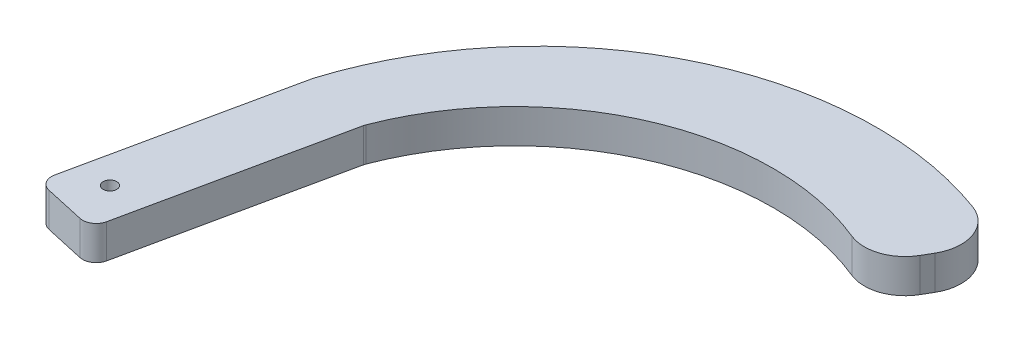
ISO-10303-21;
HEADER;
FILE_DESCRIPTION(('STEP AP214'),'2;1');
FILE_NAME('part.step','',(''),(''),'','','');
FILE_SCHEMA(('AUTOMOTIVE_DESIGN { 1 0 10303 214 1 1 1 1 }'));
ENDSEC;
DATA;
#1=APPLICATION_CONTEXT('core data for automotive mechanical design processes');
#2=APPLICATION_PROTOCOL_DEFINITION('international standard','automotive_design',2000,#1);
#3=PRODUCT_CONTEXT('',#1,'mechanical');
#4=PRODUCT('Part','Part','',(#3));
#5=PRODUCT_RELATED_PRODUCT_CATEGORY('part','',(#4));
#6=PRODUCT_DEFINITION_FORMATION('','',#4);
#7=PRODUCT_DEFINITION_CONTEXT('part definition',#1,'design');
#8=PRODUCT_DEFINITION('design','',#6,#7);
#9=PRODUCT_DEFINITION_SHAPE('','',#8);
#10=(LENGTH_UNIT() NAMED_UNIT(*) SI_UNIT(.MILLI.,.METRE.));
#11=(NAMED_UNIT(*) PLANE_ANGLE_UNIT() SI_UNIT($,.RADIAN.));
#12=(NAMED_UNIT(*) SI_UNIT($,.STERADIAN.) SOLID_ANGLE_UNIT());
#13=UNCERTAINTY_MEASURE_WITH_UNIT(LENGTH_MEASURE(1.E-05),#10,'distance_accuracy_value','');
#14=(GEOMETRIC_REPRESENTATION_CONTEXT(3) GLOBAL_UNCERTAINTY_ASSIGNED_CONTEXT((#13)) GLOBAL_UNIT_ASSIGNED_CONTEXT((#10,
#11,#12)) REPRESENTATION_CONTEXT('',''));
#15=CARTESIAN_POINT('',(0.,0.,0.));
#16=DIRECTION('',(0.,0.,1.));
#17=DIRECTION('',(1.,0.,0.));
#18=AXIS2_PLACEMENT_3D('',#15,#16,#17);
#19=CARTESIAN_POINT('',(60.5578918129305,6.35,18.64433074397));
#20=DIRECTION('',(0.,-1.,0.));
#21=DIRECTION('',(0.,0.,-1.));
#22=AXIS2_PLACEMENT_3D('',#19,#20,#21);
#23=PLANE('',#22);
#24=CARTESIAN_POINT('',(60.5578918129305,6.35,18.64433074397));
#25=DIRECTION('',(0.,1.,0.));
#26=DIRECTION('',(0.,0.,-1.));
#27=AXIS2_PLACEMENT_3D('',#24,#25,#26);
#28=CIRCLE('',#27,63.3629965336011);
#29=CARTESIAN_POINT('',(82.4371898984211,6.35,-40.8213370400832));
#30=VERTEX_POINT('',#29);
#31=CARTESIAN_POINT('',(0.0340792868652462,6.35,-0.110333929834405));
#32=VERTEX_POINT('',#31);
#33=EDGE_CURVE('E150',#30,#32,#28,.T.);
#34=ORIENTED_EDGE('',*,*,#33,.T.);
#35=CARTESIAN_POINT('',(2.4602663712258,6.35,0.641474710500365));
#36=DIRECTION('',(0.,-1.,0.));
#37=DIRECTION('',(0.,0.,-1.));
#38=AXIS2_PLACEMENT_3D('',#35,#36,#37);
#39=CIRCLE('',#38,2.54);
#40=CARTESIAN_POINT('',(-0.0236448872723517,6.35,0.110640593373262));
#41=VERTEX_POINT('',#40);
#42=EDGE_CURVE('E227',#32,#41,#39,.F.);
#43=ORIENTED_EDGE('',*,*,#42,.T.);
#44=DIRECTION('',(-0.20898980989256,0.,0.97791781830636));
#45=VECTOR('',#44,1.);
#46=CARTESIAN_POINT('',(0.,6.35,0.));
#47=LINE('',#46,#45);
#48=CARTESIAN_POINT('',(-8.49810560298567,6.35,39.7648521489212));
#49=VERTEX_POINT('',#48);
#50=EDGE_CURVE('E269',#41,#49,#47,.T.);
#51=ORIENTED_EDGE('',*,*,#50,.T.);
#52=CARTESIAN_POINT('',(-6.01419434448752,6.35,40.2956862660483));
#53=DIRECTION('',(0.,-1.,0.));
#54=DIRECTION('',(0.,0.,-1.));
#55=AXIS2_PLACEMENT_3D('',#52,#53,#54);
#56=CIRCLE('',#55,2.54);
#57=CARTESIAN_POINT('',(-6.56587830956438,6.35,42.7750500559502));
#58=VERTEX_POINT('',#57);
#59=EDGE_CURVE('E224',#49,#58,#56,.F.);
#60=ORIENTED_EDGE('',*,*,#59,.T.);
#61=DIRECTION('',(0.976127476339359,0.,0.217198411447583));
#62=VECTOR('',#61,1.);
#63=CARTESIAN_POINT('',(-9.02449849487913,6.35,42.2279817564224));
#64=LINE('',#63,#62);
#65=CARTESIAN_POINT('',(0.872475583690637,6.35,44.4301603653728));
#66=VERTEX_POINT('',#65);
#67=EDGE_CURVE('E263',#58,#66,#64,.T.);
#68=ORIENTED_EDGE('',*,*,#67,.T.);
#69=CARTESIAN_POINT('',(1.4241595487675,6.35,41.9507965754709));
#70=DIRECTION('',(0.,-1.,0.));
#71=DIRECTION('',(0.,0.,-1.));
#72=AXIS2_PLACEMENT_3D('',#69,#70,#71);
#73=CIRCLE('',#72,2.54);
#74=CARTESIAN_POINT('',(3.90807080726565,6.35,42.481630692598));
#75=VERTEX_POINT('',#74);
#76=EDGE_CURVE('E221',#66,#75,#73,.F.);
#77=ORIENTED_EDGE('',*,*,#76,.T.);
#78=DIRECTION('',(0.20898980989256,0.,-0.97791781830636));
#79=VECTOR('',#78,1.);
#80=CARTESIAN_POINT('',(12.3972564887583,6.35,2.75851718237099));
#81=LINE('',#80,#79);
#82=CARTESIAN_POINT('',(12.3563941309286,6.35,2.94972281024476));
#83=VERTEX_POINT('',#82);
#84=EDGE_CURVE('E259',#75,#83,#81,.T.);
#85=ORIENTED_EDGE('',*,*,#84,.T.);
#86=CARTESIAN_POINT('',(14.8403053894267,6.35,3.48055692737186));
#87=DIRECTION('',(0.,-1.,0.));
#88=DIRECTION('',(0.,0.,-1.));
#89=AXIS2_PLACEMENT_3D('',#86,#87,#88);
#90=CIRCLE('',#89,2.54);
#91=CARTESIAN_POINT('',(12.4688141612082,6.35,2.57081556056331));
#92=VERTEX_POINT('',#91);
#93=EDGE_CURVE('E11',#83,#92,#90,.T.);
#94=ORIENTED_EDGE('',*,*,#93,.T.);
#95=CARTESIAN_POINT('',(57.5427590882242,6.35,19.8618903819368));
#96=DIRECTION('',(0.,-1.,0.));
#97=DIRECTION('',(0.,0.,-1.));
#98=AXIS2_PLACEMENT_3D('',#95,#96,#97);
#99=CIRCLE('',#98,48.2767208886644);
#100=CARTESIAN_POINT('',(75.8608882722929,6.35,-24.804516715095));
#101=VERTEX_POINT('',#100);
#102=EDGE_CURVE('E255',#92,#101,#99,.T.);
#103=ORIENTED_EDGE('',*,*,#102,.T.);
#104=CARTESIAN_POINT('',(78.7522226838515,6.35,-31.8546646086174));
#105=DIRECTION('',(0.,-1.,0.));
#106=DIRECTION('',(0.,0.,-1.));
#107=AXIS2_PLACEMENT_3D('',#104,#105,#106);
#108=CIRCLE('',#107,7.62);
#109=CARTESIAN_POINT('',(85.3423987423466,6.35,-28.0292261346594));
#110=VERTEX_POINT('',#109);
#111=EDGE_CURVE('E193',#101,#110,#108,.F.);
#112=ORIENTED_EDGE('',*,*,#111,.T.);
#113=DIRECTION('',(0.502026046451173,0.,-0.864852501114846));
#114=VECTOR('',#113,1.);
#115=CARTESIAN_POINT('',(81.7789304115871,6.35,-21.890352424248));
#116=LINE('',#115,#114);
#117=CARTESIAN_POINT('',(86.3961732966539,6.35,-29.844589232543));
#118=VERTEX_POINT('',#117);
#119=EDGE_CURVE('E152',#110,#118,#116,.T.);
#120=ORIENTED_EDGE('',*,*,#119,.T.);
#121=CARTESIAN_POINT('',(79.8059972381588,6.35,-33.6700277065009));
#122=DIRECTION('',(0.,-1.,0.));
#123=DIRECTION('',(0.,0.,-1.));
#124=AXIS2_PLACEMENT_3D('',#121,#122,#123);
#125=CIRCLE('',#124,7.62);
#126=EDGE_CURVE('E196',#118,#30,#125,.F.);
#127=ORIENTED_EDGE('',*,*,#126,.T.);
#128=EDGE_LOOP('',(#34,#43,#51,#60,#68,#77,#85,#94,#103,#112,#120,#127));
#129=FACE_BOUND('',#128,.T.);
#130=CARTESIAN_POINT('',(-1.63503526528075,6.35,36.3151936826149));
#131=DIRECTION('',(0.,1.,0.));
#132=DIRECTION('',(0.,0.,1.));
#133=AXIS2_PLACEMENT_3D('',#130,#131,#132);
#134=CIRCLE('',#133,1.27);
#135=CARTESIAN_POINT('',(-1.63503526528075,6.35,37.5851936826149));
#136=VERTEX_POINT('',#135);
#137=EDGE_CURVE('E160',#136,#136,#134,.T.);
#138=ORIENTED_EDGE('',*,*,#137,.F.);
#139=EDGE_LOOP('',(#138));
#140=FACE_BOUND('',#139,.T.);
#141=ADVANCED_FACE('F39',(#129,#140),#23,.F.);
#142=CARTESIAN_POINT('',(60.5578918129305,0.,18.64433074397));
#143=DIRECTION('',(0.,-1.,0.));
#144=DIRECTION('',(0.,0.,-1.));
#145=AXIS2_PLACEMENT_3D('',#142,#143,#144);
#146=PLANE('',#145);
#147=DIRECTION('',(-0.20898980989256,0.,0.97791781830636));
#148=VECTOR('',#147,1.);
#149=CARTESIAN_POINT('',(0.,0.,0.));
#150=LINE('',#149,#148);
#151=CARTESIAN_POINT('',(-0.0236448872723517,0.,0.110640593373262));
#152=VERTEX_POINT('',#151);
#153=CARTESIAN_POINT('',(-8.49810560298567,0.,39.7648521489212));
#154=VERTEX_POINT('',#153);
#155=EDGE_CURVE('E159',#152,#154,#150,.T.);
#156=ORIENTED_EDGE('',*,*,#155,.F.);
#157=CARTESIAN_POINT('',(2.4602663712258,0.,0.641474710500365));
#158=DIRECTION('',(0.,-1.,0.));
#159=DIRECTION('',(0.,0.,-1.));
#160=AXIS2_PLACEMENT_3D('',#157,#158,#159);
#161=CIRCLE('',#160,2.54);
#162=CARTESIAN_POINT('',(0.0340792868652462,0.,-0.110333929834405));
#163=VERTEX_POINT('',#162);
#164=EDGE_CURVE('E157',#152,#163,#161,.T.);
#165=ORIENTED_EDGE('',*,*,#164,.T.);
#166=CARTESIAN_POINT('',(60.5578918129305,0.,18.64433074397));
#167=DIRECTION('',(0.,1.,0.));
#168=DIRECTION('',(0.,0.,-1.));
#169=AXIS2_PLACEMENT_3D('',#166,#167,#168);
#170=CIRCLE('',#169,63.3629965336011);
#171=CARTESIAN_POINT('',(82.4371898984211,0.,-40.8213370400832));
#172=VERTEX_POINT('',#171);
#173=EDGE_CURVE('E147',#172,#163,#170,.T.);
#174=ORIENTED_EDGE('',*,*,#173,.F.);
#175=CARTESIAN_POINT('',(79.8059972381588,0.,-33.6700277065009));
#176=DIRECTION('',(0.,-1.,0.));
#177=DIRECTION('',(0.,0.,-1.));
#178=AXIS2_PLACEMENT_3D('',#175,#176,#177);
#179=CIRCLE('',#178,7.62);
#180=CARTESIAN_POINT('',(86.3961732966539,0.,-29.844589232543));
#181=VERTEX_POINT('',#180);
#182=EDGE_CURVE('E129',#172,#181,#179,.T.);
#183=ORIENTED_EDGE('',*,*,#182,.T.);
#184=DIRECTION('',(0.502026046451173,0.,-0.864852501114846));
#185=VECTOR('',#184,1.);
#186=CARTESIAN_POINT('',(81.7789304115871,0.,-21.890352424248));
#187=LINE('',#186,#185);
#188=CARTESIAN_POINT('',(85.3423987423466,0.,-28.0292261346594));
#189=VERTEX_POINT('',#188);
#190=EDGE_CURVE('E182',#189,#181,#187,.T.);
#191=ORIENTED_EDGE('',*,*,#190,.F.);
#192=CARTESIAN_POINT('',(78.7522226838515,0.,-31.8546646086174));
#193=DIRECTION('',(0.,-1.,0.));
#194=DIRECTION('',(0.,0.,-1.));
#195=AXIS2_PLACEMENT_3D('',#192,#193,#194);
#196=CIRCLE('',#195,7.62);
#197=CARTESIAN_POINT('',(75.8608882722929,0.,-24.804516715095));
#198=VERTEX_POINT('',#197);
#199=EDGE_CURVE('E141',#189,#198,#196,.T.);
#200=ORIENTED_EDGE('',*,*,#199,.T.);
#201=CARTESIAN_POINT('',(57.5427590882242,0.,19.8618903819368));
#202=DIRECTION('',(0.,-1.,0.));
#203=DIRECTION('',(0.,0.,-1.));
#204=AXIS2_PLACEMENT_3D('',#201,#202,#203);
#205=CIRCLE('',#204,48.2767208886644);
#206=CARTESIAN_POINT('',(12.4688141612082,0.,2.57081556056331));
#207=VERTEX_POINT('',#206);
#208=EDGE_CURVE('E179',#207,#198,#205,.T.);
#209=ORIENTED_EDGE('',*,*,#208,.F.);
#210=CARTESIAN_POINT('',(14.8403053894267,0.,3.48055692737186));
#211=DIRECTION('',(0.,-1.,0.));
#212=DIRECTION('',(0.,0.,-1.));
#213=AXIS2_PLACEMENT_3D('',#210,#211,#212);
#214=CIRCLE('',#213,2.54);
#215=CARTESIAN_POINT('',(12.3563941309286,0.,2.94972281024476));
#216=VERTEX_POINT('',#215);
#217=EDGE_CURVE('E48',#207,#216,#214,.F.);
#218=ORIENTED_EDGE('',*,*,#217,.T.);
#219=DIRECTION('',(0.20898980989256,0.,-0.97791781830636));
#220=VECTOR('',#219,1.);
#221=CARTESIAN_POINT('',(12.3972564887583,0.,2.75851718237099));
#222=LINE('',#221,#220);
#223=CARTESIAN_POINT('',(3.90807080726565,0.,42.481630692598));
#224=VERTEX_POINT('',#223);
#225=EDGE_CURVE('E176',#224,#216,#222,.T.);
#226=ORIENTED_EDGE('',*,*,#225,.F.);
#227=CARTESIAN_POINT('',(1.4241595487675,0.,41.9507965754709));
#228=DIRECTION('',(0.,-1.,0.));
#229=DIRECTION('',(0.,0.,-1.));
#230=AXIS2_PLACEMENT_3D('',#227,#228,#229);
#231=CIRCLE('',#230,2.54);
#232=CARTESIAN_POINT('',(0.872475583690637,0.,44.4301603653728));
#233=VERTEX_POINT('',#232);
#234=EDGE_CURVE('E210',#224,#233,#231,.T.);
#235=ORIENTED_EDGE('',*,*,#234,.T.);
#236=DIRECTION('',(0.976127476339359,0.,0.217198411447583));
#237=VECTOR('',#236,1.);
#238=CARTESIAN_POINT('',(-9.02449849487913,0.,42.2279817564224));
#239=LINE('',#238,#237);
#240=CARTESIAN_POINT('',(-6.56587830956438,0.,42.7750500559502));
#241=VERTEX_POINT('',#240);
#242=EDGE_CURVE('E165',#241,#233,#239,.T.);
#243=ORIENTED_EDGE('',*,*,#242,.F.);
#244=CARTESIAN_POINT('',(-6.01419434448752,0.,40.2956862660483));
#245=DIRECTION('',(0.,-1.,0.));
#246=DIRECTION('',(0.,0.,-1.));
#247=AXIS2_PLACEMENT_3D('',#244,#245,#246);
#248=CIRCLE('',#247,2.54);
#249=EDGE_CURVE('E213',#241,#154,#248,.T.);
#250=ORIENTED_EDGE('',*,*,#249,.T.);
#251=EDGE_LOOP('',(#156,#165,#174,#183,#191,#200,#209,#218,#226,#235,#243,#250));
#252=FACE_BOUND('',#251,.T.);
#253=CARTESIAN_POINT('',(-1.63503526528075,0.,36.3151936826149));
#254=DIRECTION('',(0.,1.,0.));
#255=DIRECTION('',(0.,0.,1.));
#256=AXIS2_PLACEMENT_3D('',#253,#254,#255);
#257=CIRCLE('',#256,1.27);
#258=CARTESIAN_POINT('',(-1.63503526528075,0.,37.5851936826149));
#259=VERTEX_POINT('',#258);
#260=EDGE_CURVE('E168',#259,#259,#257,.T.);
#261=ORIENTED_EDGE('',*,*,#260,.T.);
#262=EDGE_LOOP('',(#261));
#263=FACE_BOUND('',#262,.T.);
#264=ADVANCED_FACE('F155',(#252,#263),#146,.T.);
#265=CARTESIAN_POINT('',(60.5578918129305,6.35,18.64433074397));
#266=DIRECTION('',(0.,-1.,0.));
#267=DIRECTION('',(0.,0.,-1.));
#268=AXIS2_PLACEMENT_3D('',#265,#266,#267);
#269=CYLINDRICAL_SURFACE('',#268,63.3629965336011);
#270=ORIENTED_EDGE('',*,*,#173,.T.);
#271=DIRECTION('',(0.,-1.,0.));
#272=VECTOR('',#271,1.);
#273=CARTESIAN_POINT('',(0.0340792868652323,6.35,-0.110333929834408));
#274=LINE('',#273,#272);
#275=EDGE_CURVE('E218',#163,#32,#274,.F.);
#276=ORIENTED_EDGE('',*,*,#275,.T.);
#277=ORIENTED_EDGE('',*,*,#33,.F.);
#278=DIRECTION('',(0.,-1.,0.));
#279=VECTOR('',#278,1.);
#280=CARTESIAN_POINT('',(82.4371898984211,6.35,-40.8213370400833));
#281=LINE('',#280,#279);
#282=EDGE_CURVE('E133',#30,#172,#281,.T.);
#283=ORIENTED_EDGE('',*,*,#282,.T.);
#284=EDGE_LOOP('',(#270,#276,#277,#283));
#285=FACE_BOUND('',#284,.T.);
#286=ADVANCED_FACE('F146',(#285),#269,.T.);
#287=CARTESIAN_POINT('',(0.,6.35,0.));
#288=DIRECTION('',(0.97791781830636,0.,0.20898980989256));
#289=DIRECTION('',(0.20898980989256,0.,-0.97791781830636));
#290=AXIS2_PLACEMENT_3D('',#287,#288,#289);
#291=PLANE('',#290);
#292=ORIENTED_EDGE('',*,*,#50,.F.);
#293=DIRECTION('',(0.,-1.,0.));
#294=VECTOR('',#293,1.);
#295=CARTESIAN_POINT('',(-0.0236448872723517,6.35,0.110640593373262));
#296=LINE('',#295,#294);
#297=EDGE_CURVE('E206',#41,#152,#296,.T.);
#298=ORIENTED_EDGE('',*,*,#297,.T.);
#299=ORIENTED_EDGE('',*,*,#155,.T.);
#300=DIRECTION('',(0.,-1.,0.));
#301=VECTOR('',#300,1.);
#302=CARTESIAN_POINT('',(-8.49810560298567,6.35,39.7648521489212));
#303=LINE('',#302,#301);
#304=EDGE_CURVE('E203',#154,#49,#303,.F.);
#305=ORIENTED_EDGE('',*,*,#304,.T.);
#306=EDGE_LOOP('',(#292,#298,#299,#305));
#307=FACE_BOUND('',#306,.T.);
#308=ADVANCED_FACE('F307',(#307),#291,.F.);
#309=CARTESIAN_POINT('',(-9.02449849487913,6.35,42.2279817564224));
#310=DIRECTION('',(0.217198411447583,0.,-0.976127476339359));
#311=DIRECTION('',(-0.976127476339359,0.,-0.217198411447583));
#312=AXIS2_PLACEMENT_3D('',#309,#310,#311);
#313=PLANE('',#312);
#314=ORIENTED_EDGE('',*,*,#67,.F.);
#315=DIRECTION('',(0.,-1.,0.));
#316=VECTOR('',#315,1.);
#317=CARTESIAN_POINT('',(-6.56587830956438,6.35,42.7750500559502));
#318=LINE('',#317,#316);
#319=EDGE_CURVE('E233',#58,#241,#318,.T.);
#320=ORIENTED_EDGE('',*,*,#319,.T.);
#321=ORIENTED_EDGE('',*,*,#242,.T.);
#322=DIRECTION('',(0.,-1.,0.));
#323=VECTOR('',#322,1.);
#324=CARTESIAN_POINT('',(0.872475583690637,6.35,44.4301603653728));
#325=LINE('',#324,#323);
#326=EDGE_CURVE('E230',#233,#66,#325,.F.);
#327=ORIENTED_EDGE('',*,*,#326,.T.);
#328=EDGE_LOOP('',(#314,#320,#321,#327));
#329=FACE_BOUND('',#328,.T.);
#330=ADVANCED_FACE('F304',(#329),#313,.F.);
#331=CARTESIAN_POINT('',(12.3972564887583,6.35,2.75851718237099));
#332=DIRECTION('',(-0.97791781830636,0.,-0.20898980989256));
#333=DIRECTION('',(-0.20898980989256,0.,0.97791781830636));
#334=AXIS2_PLACEMENT_3D('',#331,#332,#333);
#335=PLANE('',#334);
#336=ORIENTED_EDGE('',*,*,#84,.F.);
#337=DIRECTION('',(0.,-1.,0.));
#338=VECTOR('',#337,1.);
#339=CARTESIAN_POINT('',(3.90807080726565,6.35,42.481630692598));
#340=LINE('',#339,#338);
#341=EDGE_CURVE('E239',#75,#224,#340,.T.);
#342=ORIENTED_EDGE('',*,*,#341,.T.);
#343=ORIENTED_EDGE('',*,*,#225,.T.);
#344=DIRECTION('',(0.,1.,0.));
#345=VECTOR('',#344,1.);
#346=CARTESIAN_POINT('',(12.3563941309286,6.35,2.94972281024476));
#347=LINE('',#346,#345);
#348=EDGE_CURVE('E61',#216,#83,#347,.T.);
#349=ORIENTED_EDGE('',*,*,#348,.T.);
#350=EDGE_LOOP('',(#336,#342,#343,#349));
#351=FACE_BOUND('',#350,.T.);
#352=ADVANCED_FACE('F251',(#351),#335,.F.);
#353=CARTESIAN_POINT('',(57.5427590882242,6.35,19.8618903819368));
#354=DIRECTION('',(0.,-1.,0.));
#355=DIRECTION('',(0.,0.,-1.));
#356=AXIS2_PLACEMENT_3D('',#353,#354,#355);
#357=CYLINDRICAL_SURFACE('',#356,48.2767208886644);
#358=ORIENTED_EDGE('',*,*,#102,.F.);
#359=DIRECTION('',(0.,-1.,0.));
#360=VECTOR('',#359,1.);
#361=CARTESIAN_POINT('',(12.4688141612082,6.35,2.57081556056331));
#362=LINE('',#361,#360);
#363=EDGE_CURVE('E243',#92,#207,#362,.T.);
#364=ORIENTED_EDGE('',*,*,#363,.T.);
#365=ORIENTED_EDGE('',*,*,#208,.T.);
#366=DIRECTION('',(0.,-1.,0.));
#367=VECTOR('',#366,1.);
#368=CARTESIAN_POINT('',(75.8608882722929,6.35,-24.804516715095));
#369=LINE('',#368,#367);
#370=EDGE_CURVE('E199',#198,#101,#369,.F.);
#371=ORIENTED_EDGE('',*,*,#370,.T.);
#372=EDGE_LOOP('',(#358,#364,#365,#371));
#373=FACE_BOUND('',#372,.T.);
#374=ADVANCED_FACE('F254',(#373),#357,.F.);
#375=CARTESIAN_POINT('',(81.7789304115871,6.35,-21.890352424248));
#376=DIRECTION('',(-0.864852501114846,0.,-0.502026046451173));
#377=DIRECTION('',(-0.502026046451173,0.,0.864852501114846));
#378=AXIS2_PLACEMENT_3D('',#375,#376,#377);
#379=PLANE('',#378);
#380=ORIENTED_EDGE('',*,*,#190,.T.);
#381=DIRECTION('',(0.,-1.,0.));
#382=VECTOR('',#381,1.);
#383=CARTESIAN_POINT('',(86.3961732966539,6.35,-29.844589232543));
#384=LINE('',#383,#382);
#385=EDGE_CURVE('E134',#181,#118,#384,.F.);
#386=ORIENTED_EDGE('',*,*,#385,.T.);
#387=ORIENTED_EDGE('',*,*,#119,.F.);
#388=DIRECTION('',(0.,-1.,0.));
#389=VECTOR('',#388,1.);
#390=CARTESIAN_POINT('',(85.3423987423466,6.35,-28.0292261346594));
#391=LINE('',#390,#389);
#392=EDGE_CURVE('E140',#110,#189,#391,.T.);
#393=ORIENTED_EDGE('',*,*,#392,.T.);
#394=EDGE_LOOP('',(#380,#386,#387,#393));
#395=FACE_BOUND('',#394,.T.);
#396=ADVANCED_FACE('F281',(#395),#379,.F.);
#397=CARTESIAN_POINT('',(-1.63503526528075,6.35,36.3151936826149));
#398=DIRECTION('',(0.,-1.,0.));
#399=DIRECTION('',(0.,0.,-1.));
#400=AXIS2_PLACEMENT_3D('',#397,#398,#399);
#401=CYLINDRICAL_SURFACE('',#400,1.27);
#402=ORIENTED_EDGE('',*,*,#137,.T.);
#403=EDGE_LOOP('',(#402));
#404=FACE_BOUND('',#403,.T.);
#405=ORIENTED_EDGE('',*,*,#260,.F.);
#406=EDGE_LOOP('',(#405));
#407=FACE_BOUND('',#406,.T.);
#408=ADVANCED_FACE('F279',(#404,#407),#401,.F.);
#409=CARTESIAN_POINT('',(79.8059972381588,6.35,-33.6700277065009));
#410=DIRECTION('',(0.,-1.,0.));
#411=DIRECTION('',(0.,0.,-1.));
#412=AXIS2_PLACEMENT_3D('',#409,#410,#411);
#413=CYLINDRICAL_SURFACE('',#412,7.62);
#414=ORIENTED_EDGE('',*,*,#126,.F.);
#415=ORIENTED_EDGE('',*,*,#385,.F.);
#416=ORIENTED_EDGE('',*,*,#182,.F.);
#417=ORIENTED_EDGE('',*,*,#282,.F.);
#418=EDGE_LOOP('',(#414,#415,#416,#417));
#419=FACE_BOUND('',#418,.T.);
#420=ADVANCED_FACE('F132',(#419),#413,.T.);
#421=CARTESIAN_POINT('',(78.7522226838515,6.35,-31.8546646086174));
#422=DIRECTION('',(0.,-1.,0.));
#423=DIRECTION('',(0.,0.,-1.));
#424=AXIS2_PLACEMENT_3D('',#421,#422,#423);
#425=CYLINDRICAL_SURFACE('',#424,7.62);
#426=ORIENTED_EDGE('',*,*,#111,.F.);
#427=ORIENTED_EDGE('',*,*,#370,.F.);
#428=ORIENTED_EDGE('',*,*,#199,.F.);
#429=ORIENTED_EDGE('',*,*,#392,.F.);
#430=EDGE_LOOP('',(#426,#427,#428,#429));
#431=FACE_BOUND('',#430,.T.);
#432=ADVANCED_FACE('F288',(#431),#425,.T.);
#433=CARTESIAN_POINT('',(2.4602663712258,6.35,0.641474710500365));
#434=DIRECTION('',(0.,-1.,0.));
#435=DIRECTION('',(0.,0.,-1.));
#436=AXIS2_PLACEMENT_3D('',#433,#434,#435);
#437=CYLINDRICAL_SURFACE('',#436,2.54);
#438=ORIENTED_EDGE('',*,*,#42,.F.);
#439=ORIENTED_EDGE('',*,*,#275,.F.);
#440=ORIENTED_EDGE('',*,*,#164,.F.);
#441=ORIENTED_EDGE('',*,*,#297,.F.);
#442=EDGE_LOOP('',(#438,#439,#440,#441));
#443=FACE_BOUND('',#442,.T.);
#444=ADVANCED_FACE('F316',(#443),#437,.T.);
#445=CARTESIAN_POINT('',(-6.01419434448752,6.35,40.2956862660483));
#446=DIRECTION('',(0.,-1.,0.));
#447=DIRECTION('',(0.,0.,-1.));
#448=AXIS2_PLACEMENT_3D('',#445,#446,#447);
#449=CYLINDRICAL_SURFACE('',#448,2.54);
#450=ORIENTED_EDGE('',*,*,#59,.F.);
#451=ORIENTED_EDGE('',*,*,#304,.F.);
#452=ORIENTED_EDGE('',*,*,#249,.F.);
#453=ORIENTED_EDGE('',*,*,#319,.F.);
#454=EDGE_LOOP('',(#450,#451,#452,#453));
#455=FACE_BOUND('',#454,.T.);
#456=ADVANCED_FACE('F320',(#455),#449,.T.);
#457=CARTESIAN_POINT('',(1.4241595487675,6.35,41.9507965754709));
#458=DIRECTION('',(0.,-1.,0.));
#459=DIRECTION('',(0.,0.,-1.));
#460=AXIS2_PLACEMENT_3D('',#457,#458,#459);
#461=CYLINDRICAL_SURFACE('',#460,2.54);
#462=ORIENTED_EDGE('',*,*,#76,.F.);
#463=ORIENTED_EDGE('',*,*,#326,.F.);
#464=ORIENTED_EDGE('',*,*,#234,.F.);
#465=ORIENTED_EDGE('',*,*,#341,.F.);
#466=EDGE_LOOP('',(#462,#463,#464,#465));
#467=FACE_BOUND('',#466,.T.);
#468=ADVANCED_FACE('F323',(#467),#461,.T.);
#469=CARTESIAN_POINT('',(14.8403053894267,6.35,3.48055692737186));
#470=DIRECTION('',(0.,-1.,0.));
#471=DIRECTION('',(0.,0.,-1.));
#472=AXIS2_PLACEMENT_3D('',#469,#470,#471);
#473=CYLINDRICAL_SURFACE('',#472,2.54);
#474=ORIENTED_EDGE('',*,*,#93,.F.);
#475=ORIENTED_EDGE('',*,*,#348,.F.);
#476=ORIENTED_EDGE('',*,*,#217,.F.);
#477=ORIENTED_EDGE('',*,*,#363,.F.);
#478=EDGE_LOOP('',(#474,#475,#476,#477));
#479=FACE_BOUND('',#478,.T.);
#480=ADVANCED_FACE('F41',(#479),#473,.F.);
#481=CLOSED_SHELL('',(#141,#264,#286,#308,#330,#352,#374,#396,#408,#420,#432,#444,#456,#468,#480));
#482=MANIFOLD_SOLID_BREP('B2',#481);
#483=ADVANCED_BREP_SHAPE_REPRESENTATION('',(#18,#482),#14);
#484=SHAPE_DEFINITION_REPRESENTATION(#9,#483);
ENDSEC;
END-ISO-10303-21;
